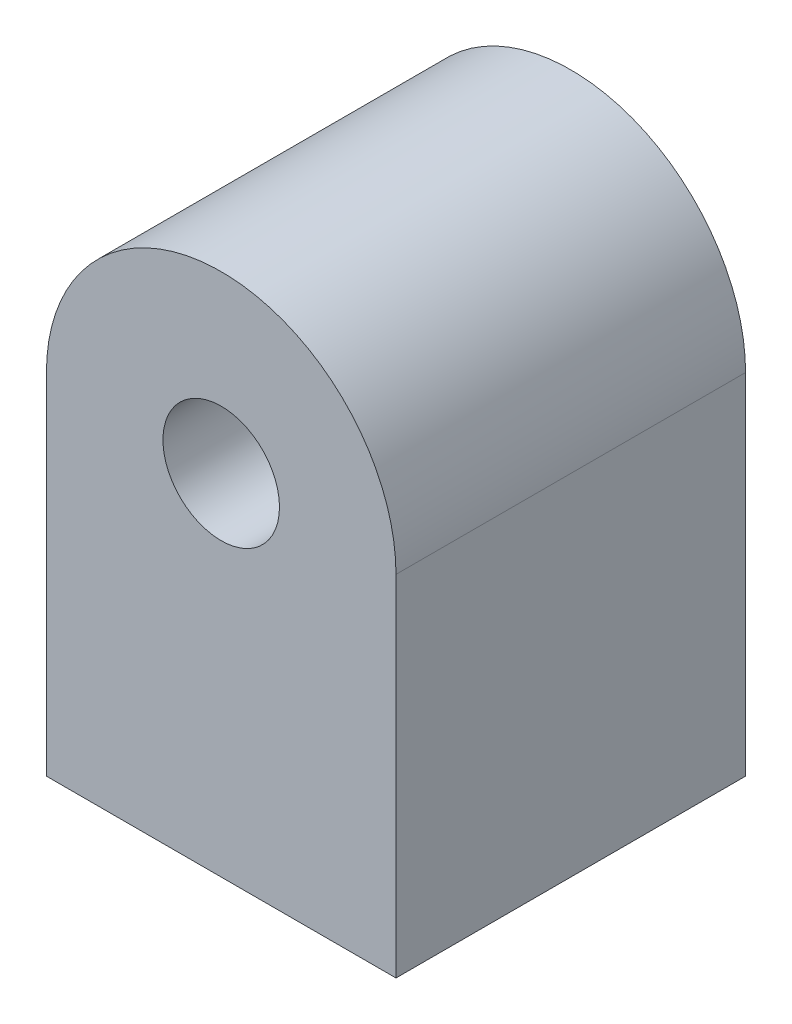
ISO-10303-21;
HEADER;
FILE_DESCRIPTION(('STEP AP214'),'2;1');
FILE_NAME('part.step','',(''),(''),'','','');
FILE_SCHEMA(('AUTOMOTIVE_DESIGN { 1 0 10303 214 1 1 1 1 }'));
ENDSEC;
DATA;
#1=APPLICATION_CONTEXT('core data for automotive mechanical design processes');
#2=APPLICATION_PROTOCOL_DEFINITION('international standard','automotive_design',2000,#1);
#3=PRODUCT_CONTEXT('',#1,'mechanical');
#4=PRODUCT('Part','Part','',(#3));
#5=PRODUCT_RELATED_PRODUCT_CATEGORY('part','',(#4));
#6=PRODUCT_DEFINITION_FORMATION('','',#4);
#7=PRODUCT_DEFINITION_CONTEXT('part definition',#1,'design');
#8=PRODUCT_DEFINITION('design','',#6,#7);
#9=PRODUCT_DEFINITION_SHAPE('','',#8);
#10=(LENGTH_UNIT() NAMED_UNIT(*) SI_UNIT(.MILLI.,.METRE.));
#11=(NAMED_UNIT(*) PLANE_ANGLE_UNIT() SI_UNIT($,.RADIAN.));
#12=(NAMED_UNIT(*) SI_UNIT($,.STERADIAN.) SOLID_ANGLE_UNIT());
#13=UNCERTAINTY_MEASURE_WITH_UNIT(LENGTH_MEASURE(1.E-05),#10,'distance_accuracy_value','');
#14=(GEOMETRIC_REPRESENTATION_CONTEXT(3) GLOBAL_UNCERTAINTY_ASSIGNED_CONTEXT((#13)) GLOBAL_UNIT_ASSIGNED_CONTEXT((#10,
#11,#12)) REPRESENTATION_CONTEXT('',''));
#15=CARTESIAN_POINT('',(0.,0.,0.));
#16=DIRECTION('',(0.,0.,1.));
#17=DIRECTION('',(1.,0.,0.));
#18=AXIS2_PLACEMENT_3D('',#15,#16,#17);
#19=CARTESIAN_POINT('',(30.,60.,60.));
#20=DIRECTION('',(0.,0.,1.));
#21=DIRECTION('',(1.,0.,0.));
#22=AXIS2_PLACEMENT_3D('',#19,#20,#21);
#23=PLANE('',#22);
#24=DIRECTION('',(0.,-1.,0.));
#25=VECTOR('',#24,1.);
#26=CARTESIAN_POINT('',(0.,60.,60.));
#27=LINE('',#26,#25);
#28=CARTESIAN_POINT('',(0.,60.,60.));
#29=VERTEX_POINT('',#28);
#30=CARTESIAN_POINT('',(0.,0.,60.));
#31=VERTEX_POINT('',#30);
#32=EDGE_CURVE('E85',#29,#31,#27,.T.);
#33=ORIENTED_EDGE('',*,*,#32,.T.);
#34=DIRECTION('',(1.,0.,0.));
#35=VECTOR('',#34,1.);
#36=CARTESIAN_POINT('',(0.,0.,60.));
#37=LINE('',#36,#35);
#38=CARTESIAN_POINT('',(60.,0.,60.));
#39=VERTEX_POINT('',#38);
#40=EDGE_CURVE('E80',#31,#39,#37,.T.);
#41=ORIENTED_EDGE('',*,*,#40,.T.);
#42=DIRECTION('',(0.,1.,0.));
#43=VECTOR('',#42,1.);
#44=CARTESIAN_POINT('',(60.,0.,60.));
#45=LINE('',#44,#43);
#46=CARTESIAN_POINT('',(60.,60.,60.));
#47=VERTEX_POINT('',#46);
#48=EDGE_CURVE('E83',#39,#47,#45,.T.);
#49=ORIENTED_EDGE('',*,*,#48,.T.);
#50=CARTESIAN_POINT('',(30.,60.,60.));
#51=DIRECTION('',(0.,0.,1.));
#52=DIRECTION('',(1.,0.,0.));
#53=AXIS2_PLACEMENT_3D('',#50,#51,#52);
#54=CIRCLE('',#53,30.);
#55=EDGE_CURVE('E50',#47,#29,#54,.T.);
#56=ORIENTED_EDGE('',*,*,#55,.T.);
#57=EDGE_LOOP('',(#33,#41,#49,#56));
#58=FACE_BOUND('',#57,.T.);
#59=CARTESIAN_POINT('',(30.,60.,60.));
#60=DIRECTION('',(0.,0.,1.));
#61=DIRECTION('',(1.,0.,0.));
#62=AXIS2_PLACEMENT_3D('',#59,#60,#61);
#63=CIRCLE('',#62,10.);
#64=CARTESIAN_POINT('',(40.,60.,60.));
#65=VERTEX_POINT('',#64);
#66=EDGE_CURVE('E101',#65,#65,#63,.T.);
#67=ORIENTED_EDGE('',*,*,#66,.F.);
#68=EDGE_LOOP('',(#67));
#69=FACE_BOUND('',#68,.T.);
#70=ADVANCED_FACE('F32',(#58,#69),#23,.T.);
#71=CARTESIAN_POINT('',(30.,60.,0.));
#72=DIRECTION('',(0.,0.,1.));
#73=DIRECTION('',(1.,0.,0.));
#74=AXIS2_PLACEMENT_3D('',#71,#72,#73);
#75=PLANE('',#74);
#76=DIRECTION('',(0.,-1.,0.));
#77=VECTOR('',#76,1.);
#78=CARTESIAN_POINT('',(0.,60.,0.));
#79=LINE('',#78,#77);
#80=CARTESIAN_POINT('',(0.,60.,0.));
#81=VERTEX_POINT('',#80);
#82=CARTESIAN_POINT('',(0.,0.,0.));
#83=VERTEX_POINT('',#82);
#84=EDGE_CURVE('E98',#81,#83,#79,.T.);
#85=ORIENTED_EDGE('',*,*,#84,.F.);
#86=CARTESIAN_POINT('',(30.,60.,0.));
#87=DIRECTION('',(0.,0.,1.));
#88=DIRECTION('',(1.,0.,0.));
#89=AXIS2_PLACEMENT_3D('',#86,#87,#88);
#90=CIRCLE('',#89,30.);
#91=CARTESIAN_POINT('',(60.,60.,0.));
#92=VERTEX_POINT('',#91);
#93=EDGE_CURVE('E73',#92,#81,#90,.T.);
#94=ORIENTED_EDGE('',*,*,#93,.F.);
#95=DIRECTION('',(0.,1.,0.));
#96=VECTOR('',#95,1.);
#97=CARTESIAN_POINT('',(60.,0.,0.));
#98=LINE('',#97,#96);
#99=CARTESIAN_POINT('',(60.,0.,0.));
#100=VERTEX_POINT('',#99);
#101=EDGE_CURVE('E67',#100,#92,#98,.T.);
#102=ORIENTED_EDGE('',*,*,#101,.F.);
#103=DIRECTION('',(1.,0.,0.));
#104=VECTOR('',#103,1.);
#105=CARTESIAN_POINT('',(0.,0.,0.));
#106=LINE('',#105,#104);
#107=EDGE_CURVE('E89',#83,#100,#106,.T.);
#108=ORIENTED_EDGE('',*,*,#107,.F.);
#109=EDGE_LOOP('',(#85,#94,#102,#108));
#110=FACE_BOUND('',#109,.T.);
#111=CARTESIAN_POINT('',(30.,60.,0.));
#112=DIRECTION('',(0.,0.,1.));
#113=DIRECTION('',(1.,0.,0.));
#114=AXIS2_PLACEMENT_3D('',#111,#112,#113);
#115=CIRCLE('',#114,10.);
#116=CARTESIAN_POINT('',(40.,60.,0.));
#117=VERTEX_POINT('',#116);
#118=EDGE_CURVE('E113',#117,#117,#115,.T.);
#119=ORIENTED_EDGE('',*,*,#118,.T.);
#120=EDGE_LOOP('',(#119));
#121=FACE_BOUND('',#120,.T.);
#122=ADVANCED_FACE('F109',(#110,#121),#75,.F.);
#123=CARTESIAN_POINT('',(0.,60.,60.));
#124=DIRECTION('',(1.,0.,0.));
#125=DIRECTION('',(0.,1.,0.));
#126=AXIS2_PLACEMENT_3D('',#123,#124,#125);
#127=PLANE('',#126);
#128=ORIENTED_EDGE('',*,*,#84,.T.);
#129=DIRECTION('',(0.,0.,-1.));
#130=VECTOR('',#129,1.);
#131=CARTESIAN_POINT('',(0.,0.,60.));
#132=LINE('',#131,#130);
#133=EDGE_CURVE('E11',#31,#83,#132,.T.);
#134=ORIENTED_EDGE('',*,*,#133,.F.);
#135=ORIENTED_EDGE('',*,*,#32,.F.);
#136=DIRECTION('',(0.,0.,-1.));
#137=VECTOR('',#136,1.);
#138=CARTESIAN_POINT('',(0.,60.,60.));
#139=LINE('',#138,#137);
#140=EDGE_CURVE('E94',#29,#81,#139,.T.);
#141=ORIENTED_EDGE('',*,*,#140,.T.);
#142=EDGE_LOOP('',(#128,#134,#135,#141));
#143=FACE_BOUND('',#142,.T.);
#144=ADVANCED_FACE('F34',(#143),#127,.F.);
#145=CARTESIAN_POINT('',(0.,0.,60.));
#146=DIRECTION('',(0.,1.,0.));
#147=DIRECTION('',(0.,0.,1.));
#148=AXIS2_PLACEMENT_3D('',#145,#146,#147);
#149=PLANE('',#148);
#150=CARTESIAN_POINT('',(30.,0.,30.));
#151=DIRECTION('',(0.,1.,0.));
#152=DIRECTION('',(0.,0.,1.));
#153=AXIS2_PLACEMENT_3D('',#150,#151,#152);
#154=CIRCLE('',#153,17.3205080756888);
#155=CARTESIAN_POINT('',(30.,0.,47.3205080756888));
#156=VERTEX_POINT('',#155);
#157=EDGE_CURVE('E36',#156,#156,#154,.F.);
#158=ORIENTED_EDGE('',*,*,#157,.F.);
#159=EDGE_LOOP('',(#158));
#160=FACE_BOUND('',#159,.T.);
#161=ORIENTED_EDGE('',*,*,#107,.T.);
#162=DIRECTION('',(0.,0.,-1.));
#163=VECTOR('',#162,1.);
#164=CARTESIAN_POINT('',(60.,0.,60.));
#165=LINE('',#164,#163);
#166=EDGE_CURVE('E42',#39,#100,#165,.T.);
#167=ORIENTED_EDGE('',*,*,#166,.F.);
#168=ORIENTED_EDGE('',*,*,#40,.F.);
#169=ORIENTED_EDGE('',*,*,#133,.T.);
#170=EDGE_LOOP('',(#161,#167,#168,#169));
#171=FACE_BOUND('',#170,.T.);
#172=ADVANCED_FACE('F88',(#160,#171),#149,.F.);
#173=CARTESIAN_POINT('',(60.,0.,60.));
#174=DIRECTION('',(-1.,0.,0.));
#175=DIRECTION('',(0.,-1.,0.));
#176=AXIS2_PLACEMENT_3D('',#173,#174,#175);
#177=PLANE('',#176);
#178=ORIENTED_EDGE('',*,*,#101,.T.);
#179=DIRECTION('',(0.,0.,-1.));
#180=VECTOR('',#179,1.);
#181=CARTESIAN_POINT('',(60.,60.,60.));
#182=LINE('',#181,#180);
#183=EDGE_CURVE('E90',#47,#92,#182,.T.);
#184=ORIENTED_EDGE('',*,*,#183,.F.);
#185=ORIENTED_EDGE('',*,*,#48,.F.);
#186=ORIENTED_EDGE('',*,*,#166,.T.);
#187=EDGE_LOOP('',(#178,#184,#185,#186));
#188=FACE_BOUND('',#187,.T.);
#189=ADVANCED_FACE('F92',(#188),#177,.F.);
#190=CARTESIAN_POINT('',(30.,60.,60.));
#191=DIRECTION('',(0.,0.,-1.));
#192=DIRECTION('',(-1.,0.,0.));
#193=AXIS2_PLACEMENT_3D('',#190,#191,#192);
#194=CYLINDRICAL_SURFACE('',#193,30.);
#195=ORIENTED_EDGE('',*,*,#93,.T.);
#196=ORIENTED_EDGE('',*,*,#140,.F.);
#197=ORIENTED_EDGE('',*,*,#55,.F.);
#198=ORIENTED_EDGE('',*,*,#183,.T.);
#199=EDGE_LOOP('',(#195,#196,#197,#198));
#200=FACE_BOUND('',#199,.T.);
#201=ADVANCED_FACE('F106',(#200),#194,.T.);
#202=CARTESIAN_POINT('',(30.,60.,60.));
#203=DIRECTION('',(0.,0.,-1.));
#204=DIRECTION('',(-1.,0.,0.));
#205=AXIS2_PLACEMENT_3D('',#202,#203,#204);
#206=CYLINDRICAL_SURFACE('',#205,10.);
#207=ORIENTED_EDGE('',*,*,#66,.T.);
#208=EDGE_LOOP('',(#207));
#209=FACE_BOUND('',#208,.T.);
#210=ORIENTED_EDGE('',*,*,#118,.F.);
#211=EDGE_LOOP('',(#210));
#212=FACE_BOUND('',#211,.T.);
#213=ADVANCED_FACE('F119',(#209,#212),#206,.F.);
#214=CARTESIAN_POINT('',(30.,10.,30.));
#215=DIRECTION('',(0.,1.,0.));
#216=DIRECTION('',(1.,0.,0.));
#217=AXIS2_PLACEMENT_3D('',#214,#215,#216);
#218=SPHERICAL_SURFACE('',#217,20.);
#219=ORIENTED_EDGE('',*,*,#157,.T.);
#220=EDGE_LOOP('',(#219));
#221=FACE_BOUND('',#220,.T.);
#222=ADVANCED_FACE('F141',(#221),#218,.F.);
#223=CLOSED_SHELL('',(#70,#122,#144,#172,#189,#201,#213,#222));
#224=MANIFOLD_SOLID_BREP('B2',#223);
#225=ADVANCED_BREP_SHAPE_REPRESENTATION('',(#18,#224),#14);
#226=SHAPE_DEFINITION_REPRESENTATION(#9,#225);
ENDSEC;
END-ISO-10303-21;
